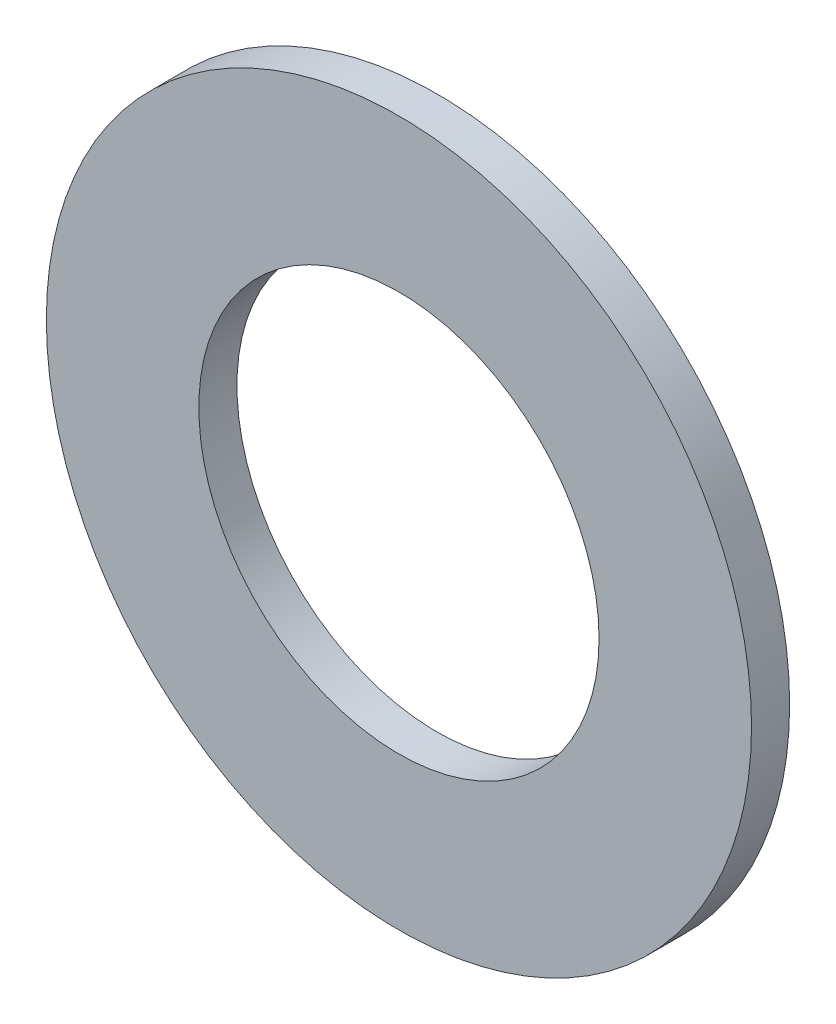
ISO-10303-21;
HEADER;
FILE_DESCRIPTION(('STEP AP214'),'2;1');
FILE_NAME('part.step','',(''),(''),'','','');
FILE_SCHEMA(('AUTOMOTIVE_DESIGN { 1 0 10303 214 1 1 1 1 }'));
ENDSEC;
DATA;
#1=APPLICATION_CONTEXT('core data for automotive mechanical design processes');
#2=APPLICATION_PROTOCOL_DEFINITION('international standard','automotive_design',2000,#1);
#3=PRODUCT_CONTEXT('',#1,'mechanical');
#4=PRODUCT('Part','Part','',(#3));
#5=PRODUCT_RELATED_PRODUCT_CATEGORY('part','',(#4));
#6=PRODUCT_DEFINITION_FORMATION('','',#4);
#7=PRODUCT_DEFINITION_CONTEXT('part definition',#1,'design');
#8=PRODUCT_DEFINITION('design','',#6,#7);
#9=PRODUCT_DEFINITION_SHAPE('','',#8);
#10=(LENGTH_UNIT() NAMED_UNIT(*) SI_UNIT(.MILLI.,.METRE.));
#11=(NAMED_UNIT(*) PLANE_ANGLE_UNIT() SI_UNIT($,.RADIAN.));
#12=(NAMED_UNIT(*) SI_UNIT($,.STERADIAN.) SOLID_ANGLE_UNIT());
#13=UNCERTAINTY_MEASURE_WITH_UNIT(LENGTH_MEASURE(1.E-05),#10,'distance_accuracy_value','');
#14=(GEOMETRIC_REPRESENTATION_CONTEXT(3) GLOBAL_UNCERTAINTY_ASSIGNED_CONTEXT((#13)) GLOBAL_UNIT_ASSIGNED_CONTEXT((#10,
#11,#12)) REPRESENTATION_CONTEXT('',''));
#15=CARTESIAN_POINT('',(0.,0.,0.));
#16=DIRECTION('',(0.,0.,1.));
#17=DIRECTION('',(1.,0.,0.));
#18=AXIS2_PLACEMENT_3D('',#15,#16,#17);
#19=CARTESIAN_POINT('',(0.,0.,0.4));
#20=DIRECTION('',(0.,0.,1.));
#21=DIRECTION('',(1.,0.,0.));
#22=AXIS2_PLACEMENT_3D('',#19,#20,#21);
#23=PLANE('',#22);
#24=CARTESIAN_POINT('',(0.,0.,0.4));
#25=DIRECTION('',(0.,0.,1.));
#26=DIRECTION('',(1.,0.,0.));
#27=AXIS2_PLACEMENT_3D('',#24,#25,#26);
#28=CIRCLE('',#27,3.7);
#29=CARTESIAN_POINT('',(3.7,0.,0.4));
#30=VERTEX_POINT('',#29);
#31=EDGE_CURVE('E10',#30,#30,#28,.T.);
#32=ORIENTED_EDGE('',*,*,#31,.T.);
#33=EDGE_LOOP('',(#32));
#34=FACE_BOUND('',#33,.T.);
#35=CARTESIAN_POINT('',(0.,0.,0.4));
#36=DIRECTION('',(0.,0.,1.));
#37=DIRECTION('',(1.,0.,0.));
#38=AXIS2_PLACEMENT_3D('',#35,#36,#37);
#39=CIRCLE('',#38,2.1);
#40=CARTESIAN_POINT('',(2.1,0.,0.4));
#41=VERTEX_POINT('',#40);
#42=EDGE_CURVE('E54',#41,#41,#39,.T.);
#43=ORIENTED_EDGE('',*,*,#42,.F.);
#44=EDGE_LOOP('',(#43));
#45=FACE_BOUND('',#44,.T.);
#46=ADVANCED_FACE('F41',(#34,#45),#23,.T.);
#47=CARTESIAN_POINT('',(0.,0.,0.));
#48=DIRECTION('',(0.,0.,1.));
#49=DIRECTION('',(1.,0.,0.));
#50=AXIS2_PLACEMENT_3D('',#47,#48,#49);
#51=PLANE('',#50);
#52=CARTESIAN_POINT('',(0.,0.,0.));
#53=DIRECTION('',(0.,0.,1.));
#54=DIRECTION('',(1.,0.,0.));
#55=AXIS2_PLACEMENT_3D('',#52,#53,#54);
#56=CIRCLE('',#55,3.7);
#57=CARTESIAN_POINT('',(3.7,0.,0.));
#58=VERTEX_POINT('',#57);
#59=EDGE_CURVE('E45',#58,#58,#56,.T.);
#60=ORIENTED_EDGE('',*,*,#59,.F.);
#61=EDGE_LOOP('',(#60));
#62=FACE_BOUND('',#61,.T.);
#63=CARTESIAN_POINT('',(0.,0.,0.));
#64=DIRECTION('',(0.,0.,1.));
#65=DIRECTION('',(1.,0.,0.));
#66=AXIS2_PLACEMENT_3D('',#63,#64,#65);
#67=CIRCLE('',#66,2.1);
#68=CARTESIAN_POINT('',(2.1,0.,0.));
#69=VERTEX_POINT('',#68);
#70=EDGE_CURVE('E56',#69,#69,#67,.T.);
#71=ORIENTED_EDGE('',*,*,#70,.T.);
#72=EDGE_LOOP('',(#71));
#73=FACE_BOUND('',#72,.T.);
#74=ADVANCED_FACE('F68',(#62,#73),#51,.F.);
#75=CARTESIAN_POINT('',(0.,0.,0.4));
#76=DIRECTION('',(0.,0.,-1.));
#77=DIRECTION('',(-1.,0.,0.));
#78=AXIS2_PLACEMENT_3D('',#75,#76,#77);
#79=CYLINDRICAL_SURFACE('',#78,3.7);
#80=ORIENTED_EDGE('',*,*,#31,.F.);
#81=EDGE_LOOP('',(#80));
#82=FACE_BOUND('',#81,.T.);
#83=ORIENTED_EDGE('',*,*,#59,.T.);
#84=EDGE_LOOP('',(#83));
#85=FACE_BOUND('',#84,.T.);
#86=ADVANCED_FACE('F43',(#82,#85),#79,.T.);
#87=CARTESIAN_POINT('',(0.,0.,0.4));
#88=DIRECTION('',(0.,0.,-1.));
#89=DIRECTION('',(-1.,0.,0.));
#90=AXIS2_PLACEMENT_3D('',#87,#88,#89);
#91=CYLINDRICAL_SURFACE('',#90,2.1);
#92=ORIENTED_EDGE('',*,*,#42,.T.);
#93=EDGE_LOOP('',(#92));
#94=FACE_BOUND('',#93,.T.);
#95=ORIENTED_EDGE('',*,*,#70,.F.);
#96=EDGE_LOOP('',(#95));
#97=FACE_BOUND('',#96,.T.);
#98=ADVANCED_FACE('F64',(#94,#97),#91,.F.);
#99=CLOSED_SHELL('',(#46,#74,#86,#98));
#100=MANIFOLD_SOLID_BREP('B2',#99);
#101=ADVANCED_BREP_SHAPE_REPRESENTATION('',(#18,#100),#14);
#102=SHAPE_DEFINITION_REPRESENTATION(#9,#101);
ENDSEC;
END-ISO-10303-21;
